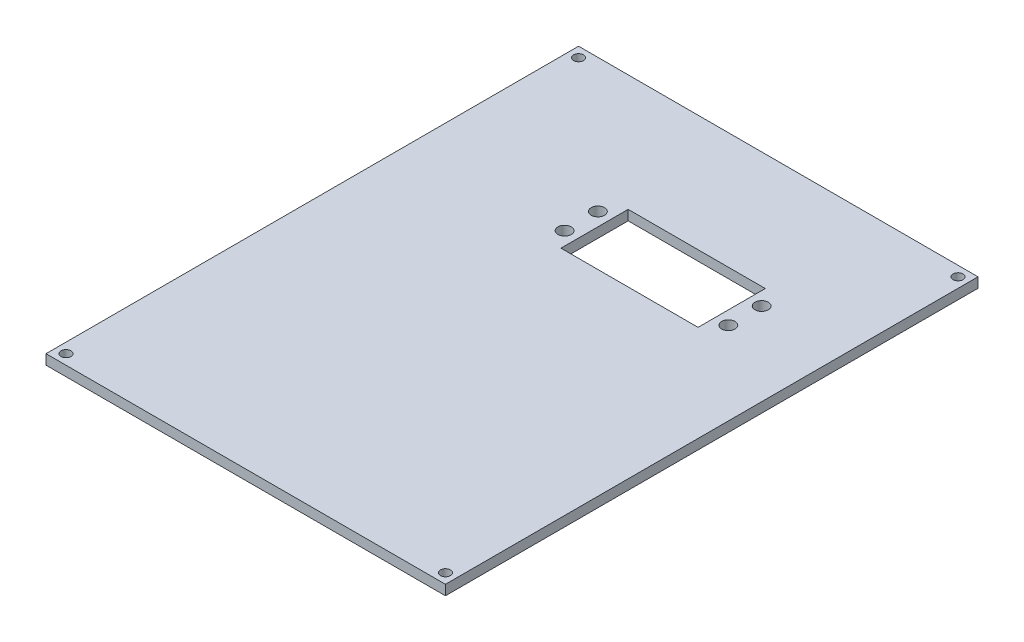
ISO-10303-21;
HEADER;
FILE_DESCRIPTION(('STEP AP214'),'2;1');
FILE_NAME('part.step','',(''),(''),'','','');
FILE_SCHEMA(('AUTOMOTIVE_DESIGN { 1 0 10303 214 1 1 1 1 }'));
ENDSEC;
DATA;
#1=APPLICATION_CONTEXT('core data for automotive mechanical design processes');
#2=APPLICATION_PROTOCOL_DEFINITION('international standard','automotive_design',2000,#1);
#3=PRODUCT_CONTEXT('',#1,'mechanical');
#4=PRODUCT('Part','Part','',(#3));
#5=PRODUCT_RELATED_PRODUCT_CATEGORY('part','',(#4));
#6=PRODUCT_DEFINITION_FORMATION('','',#4);
#7=PRODUCT_DEFINITION_CONTEXT('part definition',#1,'design');
#8=PRODUCT_DEFINITION('design','',#6,#7);
#9=PRODUCT_DEFINITION_SHAPE('','',#8);
#10=(LENGTH_UNIT() NAMED_UNIT(*) SI_UNIT(.MILLI.,.METRE.));
#11=(NAMED_UNIT(*) PLANE_ANGLE_UNIT() SI_UNIT($,.RADIAN.));
#12=(NAMED_UNIT(*) SI_UNIT($,.STERADIAN.) SOLID_ANGLE_UNIT());
#13=UNCERTAINTY_MEASURE_WITH_UNIT(LENGTH_MEASURE(1.E-05),#10,'distance_accuracy_value','');
#14=(GEOMETRIC_REPRESENTATION_CONTEXT(3) GLOBAL_UNCERTAINTY_ASSIGNED_CONTEXT((#13)) GLOBAL_UNIT_ASSIGNED_CONTEXT((#10,
#11,#12)) REPRESENTATION_CONTEXT('',''));
#15=CARTESIAN_POINT('',(0.,0.,0.));
#16=DIRECTION('',(0.,0.,1.));
#17=DIRECTION('',(1.,0.,0.));
#18=AXIS2_PLACEMENT_3D('',#15,#16,#17);
#19=CARTESIAN_POINT('',(0.,3.,0.));
#20=DIRECTION('',(0.,1.,0.));
#21=DIRECTION('',(0.,0.,1.));
#22=AXIS2_PLACEMENT_3D('',#19,#20,#21);
#23=PLANE('',#22);
#24=CARTESIAN_POINT('',(-24.9,3.,-119.9));
#25=DIRECTION('',(0.,1.,0.));
#26=DIRECTION('',(0.,0.,1.));
#27=AXIS2_PLACEMENT_3D('',#24,#25,#26);
#28=CIRCLE('',#27,2.);
#29=CARTESIAN_POINT('',(-24.9,3.,-117.9));
#30=VERTEX_POINT('',#29);
#31=EDGE_CURVE('E129',#30,#30,#28,.T.);
#32=ORIENTED_EDGE('',*,*,#31,.F.);
#33=EDGE_LOOP('',(#32));
#34=FACE_BOUND('',#33,.T.);
#35=CARTESIAN_POINT('',(-74.1,3.,-119.9));
#36=DIRECTION('',(0.,1.,0.));
#37=DIRECTION('',(0.,0.,1.));
#38=AXIS2_PLACEMENT_3D('',#35,#36,#37);
#39=CIRCLE('',#38,2.);
#40=CARTESIAN_POINT('',(-74.1,3.,-117.9));
#41=VERTEX_POINT('',#40);
#42=EDGE_CURVE('E145',#41,#41,#39,.T.);
#43=ORIENTED_EDGE('',*,*,#42,.F.);
#44=EDGE_LOOP('',(#43));
#45=FACE_BOUND('',#44,.T.);
#46=CARTESIAN_POINT('',(-117.,3.,-3.));
#47=DIRECTION('',(0.,1.,0.));
#48=DIRECTION('',(0.,0.,1.));
#49=AXIS2_PLACEMENT_3D('',#46,#47,#48);
#50=CIRCLE('',#49,1.5);
#51=CARTESIAN_POINT('',(-117.,3.,-1.5));
#52=VERTEX_POINT('',#51);
#53=EDGE_CURVE('E157',#52,#52,#50,.T.);
#54=ORIENTED_EDGE('',*,*,#53,.F.);
#55=EDGE_LOOP('',(#54));
#56=FACE_BOUND('',#55,.T.);
#57=CARTESIAN_POINT('',(-117.,3.,-157.));
#58=DIRECTION('',(0.,1.,0.));
#59=DIRECTION('',(0.,0.,1.));
#60=AXIS2_PLACEMENT_3D('',#57,#58,#59);
#61=CIRCLE('',#60,1.5);
#62=CARTESIAN_POINT('',(-117.,3.,-155.5));
#63=VERTEX_POINT('',#62);
#64=EDGE_CURVE('E169',#63,#63,#61,.T.);
#65=ORIENTED_EDGE('',*,*,#64,.F.);
#66=EDGE_LOOP('',(#65));
#67=FACE_BOUND('',#66,.T.);
#68=DIRECTION('',(0.,0.,1.));
#69=VECTOR('',#68,1.);
#70=CARTESIAN_POINT('',(-120.,3.,-160.));
#71=LINE('',#70,#69);
#72=CARTESIAN_POINT('',(-120.,3.,-160.));
#73=VERTEX_POINT('',#72);
#74=CARTESIAN_POINT('',(-120.,3.,0.));
#75=VERTEX_POINT('',#74);
#76=EDGE_CURVE('E175',#73,#75,#71,.T.);
#77=ORIENTED_EDGE('',*,*,#76,.T.);
#78=DIRECTION('',(1.,0.,0.));
#79=VECTOR('',#78,1.);
#80=CARTESIAN_POINT('',(-120.,3.,0.));
#81=LINE('',#80,#79);
#82=CARTESIAN_POINT('',(0.,3.,0.));
#83=VERTEX_POINT('',#82);
#84=EDGE_CURVE('E178',#75,#83,#81,.T.);
#85=ORIENTED_EDGE('',*,*,#84,.T.);
#86=DIRECTION('',(0.,0.,-1.));
#87=VECTOR('',#86,1.);
#88=CARTESIAN_POINT('',(0.,3.,-160.));
#89=LINE('',#88,#87);
#90=CARTESIAN_POINT('',(0.,3.,-160.));
#91=VERTEX_POINT('',#90);
#92=EDGE_CURVE('E181',#83,#91,#89,.T.);
#93=ORIENTED_EDGE('',*,*,#92,.T.);
#94=DIRECTION('',(-1.,0.,0.));
#95=VECTOR('',#94,1.);
#96=CARTESIAN_POINT('',(-120.,3.,-160.));
#97=LINE('',#96,#95);
#98=EDGE_CURVE('E183',#91,#73,#97,.T.);
#99=ORIENTED_EDGE('',*,*,#98,.T.);
#100=EDGE_LOOP('',(#77,#85,#93,#99));
#101=FACE_BOUND('',#100,.T.);
#102=CARTESIAN_POINT('',(-3.,3.,-157.));
#103=DIRECTION('',(0.,1.,0.));
#104=DIRECTION('',(0.,0.,1.));
#105=AXIS2_PLACEMENT_3D('',#102,#103,#104);
#106=CIRCLE('',#105,1.5);
#107=CARTESIAN_POINT('',(-3.,3.,-155.5));
#108=VERTEX_POINT('',#107);
#109=EDGE_CURVE('E163',#108,#108,#106,.T.);
#110=ORIENTED_EDGE('',*,*,#109,.F.);
#111=EDGE_LOOP('',(#110));
#112=FACE_BOUND('',#111,.T.);
#113=CARTESIAN_POINT('',(-2.99999999999998,3.,-3.));
#114=DIRECTION('',(0.,1.,0.));
#115=DIRECTION('',(0.,0.,1.));
#116=AXIS2_PLACEMENT_3D('',#113,#114,#115);
#117=CIRCLE('',#116,1.5);
#118=CARTESIAN_POINT('',(-2.99999999999998,3.,-1.5));
#119=VERTEX_POINT('',#118);
#120=EDGE_CURVE('E151',#119,#119,#117,.T.);
#121=ORIENTED_EDGE('',*,*,#120,.F.);
#122=EDGE_LOOP('',(#121));
#123=FACE_BOUND('',#122,.T.);
#124=CARTESIAN_POINT('',(-74.1,3.,-109.9));
#125=DIRECTION('',(0.,1.,0.));
#126=DIRECTION('',(0.,0.,1.));
#127=AXIS2_PLACEMENT_3D('',#124,#125,#126);
#128=CIRCLE('',#127,2.);
#129=CARTESIAN_POINT('',(-74.1,3.,-107.9));
#130=VERTEX_POINT('',#129);
#131=EDGE_CURVE('E139',#130,#130,#128,.T.);
#132=ORIENTED_EDGE('',*,*,#131,.F.);
#133=EDGE_LOOP('',(#132));
#134=FACE_BOUND('',#133,.T.);
#135=DIRECTION('',(1.,0.,0.));
#136=VECTOR('',#135,1.);
#137=CARTESIAN_POINT('',(-70.1,3.,-104.8));
#138=LINE('',#137,#136);
#139=CARTESIAN_POINT('',(-70.1,3.,-104.8));
#140=VERTEX_POINT('',#139);
#141=CARTESIAN_POINT('',(-28.9,3.,-104.8));
#142=VERTEX_POINT('',#141);
#143=EDGE_CURVE('E108',#140,#142,#138,.T.);
#144=ORIENTED_EDGE('',*,*,#143,.F.);
#145=DIRECTION('',(0.,0.,1.));
#146=VECTOR('',#145,1.);
#147=CARTESIAN_POINT('',(-70.1,3.,-125.));
#148=LINE('',#147,#146);
#149=CARTESIAN_POINT('',(-70.1,3.,-125.));
#150=VERTEX_POINT('',#149);
#151=EDGE_CURVE('E100',#150,#140,#148,.T.);
#152=ORIENTED_EDGE('',*,*,#151,.F.);
#153=DIRECTION('',(-1.,0.,0.));
#154=VECTOR('',#153,1.);
#155=CARTESIAN_POINT('',(-70.1,3.,-125.));
#156=LINE('',#155,#154);
#157=CARTESIAN_POINT('',(-28.9,3.,-125.));
#158=VERTEX_POINT('',#157);
#159=EDGE_CURVE('E123',#158,#150,#156,.T.);
#160=ORIENTED_EDGE('',*,*,#159,.F.);
#161=DIRECTION('',(0.,0.,-1.));
#162=VECTOR('',#161,1.);
#163=CARTESIAN_POINT('',(-28.9,3.,-125.));
#164=LINE('',#163,#162);
#165=EDGE_CURVE('E121',#142,#158,#164,.T.);
#166=ORIENTED_EDGE('',*,*,#165,.F.);
#167=EDGE_LOOP('',(#144,#152,#160,#166));
#168=FACE_BOUND('',#167,.T.);
#169=CARTESIAN_POINT('',(-24.9,3.,-109.9));
#170=DIRECTION('',(0.,1.,0.));
#171=DIRECTION('',(0.,0.,1.));
#172=AXIS2_PLACEMENT_3D('',#169,#170,#171);
#173=CIRCLE('',#172,2.);
#174=CARTESIAN_POINT('',(-24.9,3.,-107.9));
#175=VERTEX_POINT('',#174);
#176=EDGE_CURVE('E298',#175,#175,#173,.T.);
#177=ORIENTED_EDGE('',*,*,#176,.F.);
#178=EDGE_LOOP('',(#177));
#179=FACE_BOUND('',#178,.T.);
#180=ADVANCED_FACE('F35',(#34,#45,#56,#67,#101,#112,#123,#134,#168,#179),#23,.T.);
#181=CARTESIAN_POINT('',(0.,0.,0.));
#182=DIRECTION('',(0.,1.,0.));
#183=DIRECTION('',(0.,0.,1.));
#184=AXIS2_PLACEMENT_3D('',#181,#182,#183);
#185=PLANE('',#184);
#186=CARTESIAN_POINT('',(-74.1,0.,-109.9));
#187=DIRECTION('',(0.,1.,0.));
#188=DIRECTION('',(0.,0.,1.));
#189=AXIS2_PLACEMENT_3D('',#186,#187,#188);
#190=CIRCLE('',#189,2.);
#191=CARTESIAN_POINT('',(-74.1,0.,-107.9));
#192=VERTEX_POINT('',#191);
#193=EDGE_CURVE('E116',#192,#192,#190,.T.);
#194=ORIENTED_EDGE('',*,*,#193,.T.);
#195=EDGE_LOOP('',(#194));
#196=FACE_BOUND('',#195,.T.);
#197=CARTESIAN_POINT('',(-74.1,0.,-119.9));
#198=DIRECTION('',(0.,1.,0.));
#199=DIRECTION('',(0.,0.,1.));
#200=AXIS2_PLACEMENT_3D('',#197,#198,#199);
#201=CIRCLE('',#200,2.);
#202=CARTESIAN_POINT('',(-74.1,0.,-117.9));
#203=VERTEX_POINT('',#202);
#204=EDGE_CURVE('E142',#203,#203,#201,.T.);
#205=ORIENTED_EDGE('',*,*,#204,.T.);
#206=EDGE_LOOP('',(#205));
#207=FACE_BOUND('',#206,.T.);
#208=CARTESIAN_POINT('',(-2.99999999999998,0.,-3.));
#209=DIRECTION('',(0.,1.,0.));
#210=DIRECTION('',(0.,0.,1.));
#211=AXIS2_PLACEMENT_3D('',#208,#209,#210);
#212=CIRCLE('',#211,1.5);
#213=CARTESIAN_POINT('',(-2.99999999999998,0.,-1.5));
#214=VERTEX_POINT('',#213);
#215=EDGE_CURVE('E148',#214,#214,#212,.T.);
#216=ORIENTED_EDGE('',*,*,#215,.T.);
#217=EDGE_LOOP('',(#216));
#218=FACE_BOUND('',#217,.T.);
#219=CARTESIAN_POINT('',(-117.,0.,-3.));
#220=DIRECTION('',(0.,1.,0.));
#221=DIRECTION('',(0.,0.,1.));
#222=AXIS2_PLACEMENT_3D('',#219,#220,#221);
#223=CIRCLE('',#222,1.5);
#224=CARTESIAN_POINT('',(-117.,0.,-1.5));
#225=VERTEX_POINT('',#224);
#226=EDGE_CURVE('E154',#225,#225,#223,.T.);
#227=ORIENTED_EDGE('',*,*,#226,.T.);
#228=EDGE_LOOP('',(#227));
#229=FACE_BOUND('',#228,.T.);
#230=CARTESIAN_POINT('',(-3.,0.,-157.));
#231=DIRECTION('',(0.,1.,0.));
#232=DIRECTION('',(0.,0.,1.));
#233=AXIS2_PLACEMENT_3D('',#230,#231,#232);
#234=CIRCLE('',#233,1.5);
#235=CARTESIAN_POINT('',(-3.,0.,-155.5));
#236=VERTEX_POINT('',#235);
#237=EDGE_CURVE('E160',#236,#236,#234,.T.);
#238=ORIENTED_EDGE('',*,*,#237,.T.);
#239=EDGE_LOOP('',(#238));
#240=FACE_BOUND('',#239,.T.);
#241=CARTESIAN_POINT('',(-117.,0.,-157.));
#242=DIRECTION('',(0.,1.,0.));
#243=DIRECTION('',(0.,0.,1.));
#244=AXIS2_PLACEMENT_3D('',#241,#242,#243);
#245=CIRCLE('',#244,1.5);
#246=CARTESIAN_POINT('',(-117.,0.,-155.5));
#247=VERTEX_POINT('',#246);
#248=EDGE_CURVE('E166',#247,#247,#245,.T.);
#249=ORIENTED_EDGE('',*,*,#248,.T.);
#250=EDGE_LOOP('',(#249));
#251=FACE_BOUND('',#250,.T.);
#252=DIRECTION('',(0.,0.,1.));
#253=VECTOR('',#252,1.);
#254=CARTESIAN_POINT('',(-120.,0.,-160.));
#255=LINE('',#254,#253);
#256=CARTESIAN_POINT('',(-120.,0.,-160.));
#257=VERTEX_POINT('',#256);
#258=CARTESIAN_POINT('',(-120.,0.,0.));
#259=VERTEX_POINT('',#258);
#260=EDGE_CURVE('E172',#257,#259,#255,.T.);
#261=ORIENTED_EDGE('',*,*,#260,.F.);
#262=DIRECTION('',(-1.,0.,0.));
#263=VECTOR('',#262,1.);
#264=CARTESIAN_POINT('',(-120.,0.,-160.));
#265=LINE('',#264,#263);
#266=CARTESIAN_POINT('',(0.,0.,-160.));
#267=VERTEX_POINT('',#266);
#268=EDGE_CURVE('E179',#267,#257,#265,.T.);
#269=ORIENTED_EDGE('',*,*,#268,.F.);
#270=DIRECTION('',(0.,0.,-1.));
#271=VECTOR('',#270,1.);
#272=CARTESIAN_POINT('',(0.,0.,-160.));
#273=LINE('',#272,#271);
#274=CARTESIAN_POINT('',(0.,0.,0.));
#275=VERTEX_POINT('',#274);
#276=EDGE_CURVE('E190',#275,#267,#273,.T.);
#277=ORIENTED_EDGE('',*,*,#276,.F.);
#278=DIRECTION('',(1.,0.,0.));
#279=VECTOR('',#278,1.);
#280=CARTESIAN_POINT('',(-120.,0.,0.));
#281=LINE('',#280,#279);
#282=EDGE_CURVE('E188',#259,#275,#281,.T.);
#283=ORIENTED_EDGE('',*,*,#282,.F.);
#284=EDGE_LOOP('',(#261,#269,#277,#283));
#285=FACE_BOUND('',#284,.T.);
#286=DIRECTION('',(0.,0.,1.));
#287=VECTOR('',#286,1.);
#288=CARTESIAN_POINT('',(-70.1,0.,-125.));
#289=LINE('',#288,#287);
#290=CARTESIAN_POINT('',(-70.1,0.,-125.));
#291=VERTEX_POINT('',#290);
#292=CARTESIAN_POINT('',(-70.1,0.,-104.8));
#293=VERTEX_POINT('',#292);
#294=EDGE_CURVE('E58',#291,#293,#289,.T.);
#295=ORIENTED_EDGE('',*,*,#294,.T.);
#296=DIRECTION('',(1.,0.,0.));
#297=VECTOR('',#296,1.);
#298=CARTESIAN_POINT('',(-70.1,0.,-104.8));
#299=LINE('',#298,#297);
#300=CARTESIAN_POINT('',(-28.9,0.,-104.8));
#301=VERTEX_POINT('',#300);
#302=EDGE_CURVE('E115',#293,#301,#299,.T.);
#303=ORIENTED_EDGE('',*,*,#302,.T.);
#304=DIRECTION('',(0.,0.,-1.));
#305=VECTOR('',#304,1.);
#306=CARTESIAN_POINT('',(-28.9,0.,-125.));
#307=LINE('',#306,#305);
#308=CARTESIAN_POINT('',(-28.9,0.,-125.));
#309=VERTEX_POINT('',#308);
#310=EDGE_CURVE('E131',#301,#309,#307,.T.);
#311=ORIENTED_EDGE('',*,*,#310,.T.);
#312=DIRECTION('',(-1.,0.,0.));
#313=VECTOR('',#312,1.);
#314=CARTESIAN_POINT('',(-70.1,0.,-125.));
#315=LINE('',#314,#313);
#316=EDGE_CURVE('E109',#309,#291,#315,.T.);
#317=ORIENTED_EDGE('',*,*,#316,.T.);
#318=EDGE_LOOP('',(#295,#303,#311,#317));
#319=FACE_BOUND('',#318,.T.);
#320=CARTESIAN_POINT('',(-24.9,0.,-119.9));
#321=DIRECTION('',(0.,1.,0.));
#322=DIRECTION('',(0.,0.,1.));
#323=AXIS2_PLACEMENT_3D('',#320,#321,#322);
#324=CIRCLE('',#323,2.);
#325=CARTESIAN_POINT('',(-24.9,0.,-117.9));
#326=VERTEX_POINT('',#325);
#327=EDGE_CURVE('E304',#326,#326,#324,.T.);
#328=ORIENTED_EDGE('',*,*,#327,.T.);
#329=EDGE_LOOP('',(#328));
#330=FACE_BOUND('',#329,.T.);
#331=CARTESIAN_POINT('',(-24.9,0.,-109.9));
#332=DIRECTION('',(0.,1.,0.));
#333=DIRECTION('',(0.,0.,1.));
#334=AXIS2_PLACEMENT_3D('',#331,#332,#333);
#335=CIRCLE('',#334,2.);
#336=CARTESIAN_POINT('',(-24.9,0.,-107.9));
#337=VERTEX_POINT('',#336);
#338=EDGE_CURVE('E301',#337,#337,#335,.T.);
#339=ORIENTED_EDGE('',*,*,#338,.T.);
#340=EDGE_LOOP('',(#339));
#341=FACE_BOUND('',#340,.T.);
#342=ADVANCED_FACE('F208',(#196,#207,#218,#229,#240,#251,#285,#319,#330,#341),#185,.F.);
#343=CARTESIAN_POINT('',(-120.,3.,-160.));
#344=DIRECTION('',(1.,0.,0.));
#345=DIRECTION('',(0.,0.,-1.));
#346=AXIS2_PLACEMENT_3D('',#343,#344,#345);
#347=PLANE('',#346);
#348=ORIENTED_EDGE('',*,*,#260,.T.);
#349=DIRECTION('',(0.,-1.,0.));
#350=VECTOR('',#349,1.);
#351=CARTESIAN_POINT('',(-120.,3.,0.));
#352=LINE('',#351,#350);
#353=EDGE_CURVE('E11',#75,#259,#352,.T.);
#354=ORIENTED_EDGE('',*,*,#353,.F.);
#355=ORIENTED_EDGE('',*,*,#76,.F.);
#356=DIRECTION('',(0.,-1.,0.));
#357=VECTOR('',#356,1.);
#358=CARTESIAN_POINT('',(-120.,3.,-160.));
#359=LINE('',#358,#357);
#360=EDGE_CURVE('E185',#73,#257,#359,.T.);
#361=ORIENTED_EDGE('',*,*,#360,.T.);
#362=EDGE_LOOP('',(#348,#354,#355,#361));
#363=FACE_BOUND('',#362,.T.);
#364=ADVANCED_FACE('F37',(#363),#347,.F.);
#365=CARTESIAN_POINT('',(-120.,3.,0.));
#366=DIRECTION('',(0.,0.,-1.));
#367=DIRECTION('',(-1.,0.,0.));
#368=AXIS2_PLACEMENT_3D('',#365,#366,#367);
#369=PLANE('',#368);
#370=ORIENTED_EDGE('',*,*,#282,.T.);
#371=DIRECTION('',(0.,-1.,0.));
#372=VECTOR('',#371,1.);
#373=CARTESIAN_POINT('',(0.,3.,0.));
#374=LINE('',#373,#372);
#375=EDGE_CURVE('E43',#83,#275,#374,.T.);
#376=ORIENTED_EDGE('',*,*,#375,.F.);
#377=ORIENTED_EDGE('',*,*,#84,.F.);
#378=ORIENTED_EDGE('',*,*,#353,.T.);
#379=EDGE_LOOP('',(#370,#376,#377,#378));
#380=FACE_BOUND('',#379,.T.);
#381=ADVANCED_FACE('F219',(#380),#369,.F.);
#382=CARTESIAN_POINT('',(0.,3.,-160.));
#383=DIRECTION('',(-1.,0.,0.));
#384=DIRECTION('',(0.,0.,1.));
#385=AXIS2_PLACEMENT_3D('',#382,#383,#384);
#386=PLANE('',#385);
#387=ORIENTED_EDGE('',*,*,#276,.T.);
#388=DIRECTION('',(0.,-1.,0.));
#389=VECTOR('',#388,1.);
#390=CARTESIAN_POINT('',(0.,3.,-160.));
#391=LINE('',#390,#389);
#392=EDGE_CURVE('E195',#91,#267,#391,.T.);
#393=ORIENTED_EDGE('',*,*,#392,.F.);
#394=ORIENTED_EDGE('',*,*,#92,.F.);
#395=ORIENTED_EDGE('',*,*,#375,.T.);
#396=EDGE_LOOP('',(#387,#393,#394,#395));
#397=FACE_BOUND('',#396,.T.);
#398=ADVANCED_FACE('F202',(#397),#386,.F.);
#399=CARTESIAN_POINT('',(-120.,3.,-160.));
#400=DIRECTION('',(0.,0.,1.));
#401=DIRECTION('',(1.,0.,0.));
#402=AXIS2_PLACEMENT_3D('',#399,#400,#401);
#403=PLANE('',#402);
#404=ORIENTED_EDGE('',*,*,#268,.T.);
#405=ORIENTED_EDGE('',*,*,#360,.F.);
#406=ORIENTED_EDGE('',*,*,#98,.F.);
#407=ORIENTED_EDGE('',*,*,#392,.T.);
#408=EDGE_LOOP('',(#404,#405,#406,#407));
#409=FACE_BOUND('',#408,.T.);
#410=ADVANCED_FACE('F212',(#409),#403,.F.);
#411=CARTESIAN_POINT('',(-117.,3.,-157.));
#412=DIRECTION('',(0.,-1.,0.));
#413=DIRECTION('',(0.,0.,-1.));
#414=AXIS2_PLACEMENT_3D('',#411,#412,#413);
#415=CYLINDRICAL_SURFACE('',#414,1.5);
#416=ORIENTED_EDGE('',*,*,#64,.T.);
#417=EDGE_LOOP('',(#416));
#418=FACE_BOUND('',#417,.T.);
#419=ORIENTED_EDGE('',*,*,#248,.F.);
#420=EDGE_LOOP('',(#419));
#421=FACE_BOUND('',#420,.T.);
#422=ADVANCED_FACE('F237',(#418,#421),#415,.F.);
#423=CARTESIAN_POINT('',(-3.,3.,-157.));
#424=DIRECTION('',(0.,-1.,0.));
#425=DIRECTION('',(0.,0.,-1.));
#426=AXIS2_PLACEMENT_3D('',#423,#424,#425);
#427=CYLINDRICAL_SURFACE('',#426,1.5);
#428=ORIENTED_EDGE('',*,*,#109,.T.);
#429=EDGE_LOOP('',(#428));
#430=FACE_BOUND('',#429,.T.);
#431=ORIENTED_EDGE('',*,*,#237,.F.);
#432=EDGE_LOOP('',(#431));
#433=FACE_BOUND('',#432,.T.);
#434=ADVANCED_FACE('F244',(#430,#433),#427,.F.);
#435=CARTESIAN_POINT('',(-117.,3.,-3.));
#436=DIRECTION('',(0.,-1.,0.));
#437=DIRECTION('',(0.,0.,-1.));
#438=AXIS2_PLACEMENT_3D('',#435,#436,#437);
#439=CYLINDRICAL_SURFACE('',#438,1.5);
#440=ORIENTED_EDGE('',*,*,#53,.T.);
#441=EDGE_LOOP('',(#440));
#442=FACE_BOUND('',#441,.T.);
#443=ORIENTED_EDGE('',*,*,#226,.F.);
#444=EDGE_LOOP('',(#443));
#445=FACE_BOUND('',#444,.T.);
#446=ADVANCED_FACE('F249',(#442,#445),#439,.F.);
#447=CARTESIAN_POINT('',(-2.99999999999998,3.,-3.));
#448=DIRECTION('',(0.,-1.,0.));
#449=DIRECTION('',(0.,0.,-1.));
#450=AXIS2_PLACEMENT_3D('',#447,#448,#449);
#451=CYLINDRICAL_SURFACE('',#450,1.5);
#452=ORIENTED_EDGE('',*,*,#120,.T.);
#453=EDGE_LOOP('',(#452));
#454=FACE_BOUND('',#453,.T.);
#455=ORIENTED_EDGE('',*,*,#215,.F.);
#456=EDGE_LOOP('',(#455));
#457=FACE_BOUND('',#456,.T.);
#458=ADVANCED_FACE('F259',(#454,#457),#451,.F.);
#459=CARTESIAN_POINT('',(-74.1,3.,-119.9));
#460=DIRECTION('',(0.,-1.,0.));
#461=DIRECTION('',(0.,0.,-1.));
#462=AXIS2_PLACEMENT_3D('',#459,#460,#461);
#463=CYLINDRICAL_SURFACE('',#462,2.);
#464=ORIENTED_EDGE('',*,*,#42,.T.);
#465=EDGE_LOOP('',(#464));
#466=FACE_BOUND('',#465,.T.);
#467=ORIENTED_EDGE('',*,*,#204,.F.);
#468=EDGE_LOOP('',(#467));
#469=FACE_BOUND('',#468,.T.);
#470=ADVANCED_FACE('F266',(#466,#469),#463,.F.);
#471=CARTESIAN_POINT('',(-74.1,3.,-109.9));
#472=DIRECTION('',(0.,-1.,0.));
#473=DIRECTION('',(0.,0.,-1.));
#474=AXIS2_PLACEMENT_3D('',#471,#472,#473);
#475=CYLINDRICAL_SURFACE('',#474,2.);
#476=ORIENTED_EDGE('',*,*,#131,.T.);
#477=EDGE_LOOP('',(#476));
#478=FACE_BOUND('',#477,.T.);
#479=ORIENTED_EDGE('',*,*,#193,.F.);
#480=EDGE_LOOP('',(#479));
#481=FACE_BOUND('',#480,.T.);
#482=ADVANCED_FACE('F270',(#478,#481),#475,.F.);
#483=CARTESIAN_POINT('',(-70.1,3.,-125.));
#484=DIRECTION('',(1.,0.,0.));
#485=DIRECTION('',(0.,0.,-1.));
#486=AXIS2_PLACEMENT_3D('',#483,#484,#485);
#487=PLANE('',#486);
#488=ORIENTED_EDGE('',*,*,#294,.F.);
#489=DIRECTION('',(0.,-1.,0.));
#490=VECTOR('',#489,1.);
#491=CARTESIAN_POINT('',(-70.1,3.,-125.));
#492=LINE('',#491,#490);
#493=EDGE_CURVE('E104',#150,#291,#492,.T.);
#494=ORIENTED_EDGE('',*,*,#493,.F.);
#495=ORIENTED_EDGE('',*,*,#151,.T.);
#496=DIRECTION('',(0.,-1.,0.));
#497=VECTOR('',#496,1.);
#498=CARTESIAN_POINT('',(-70.1,3.,-104.8));
#499=LINE('',#498,#497);
#500=EDGE_CURVE('E103',#140,#293,#499,.T.);
#501=ORIENTED_EDGE('',*,*,#500,.T.);
#502=EDGE_LOOP('',(#488,#494,#495,#501));
#503=FACE_BOUND('',#502,.T.);
#504=ADVANCED_FACE('F102',(#503),#487,.T.);
#505=CARTESIAN_POINT('',(-70.1,3.,-104.8));
#506=DIRECTION('',(0.,0.,-1.));
#507=DIRECTION('',(-1.,0.,0.));
#508=AXIS2_PLACEMENT_3D('',#505,#506,#507);
#509=PLANE('',#508);
#510=ORIENTED_EDGE('',*,*,#302,.F.);
#511=ORIENTED_EDGE('',*,*,#500,.F.);
#512=ORIENTED_EDGE('',*,*,#143,.T.);
#513=DIRECTION('',(0.,-1.,0.));
#514=VECTOR('',#513,1.);
#515=CARTESIAN_POINT('',(-28.9,3.,-104.8));
#516=LINE('',#515,#514);
#517=EDGE_CURVE('E117',#142,#301,#516,.T.);
#518=ORIENTED_EDGE('',*,*,#517,.T.);
#519=EDGE_LOOP('',(#510,#511,#512,#518));
#520=FACE_BOUND('',#519,.T.);
#521=ADVANCED_FACE('F112',(#520),#509,.T.);
#522=CARTESIAN_POINT('',(-28.9,3.,-125.));
#523=DIRECTION('',(-1.,0.,0.));
#524=DIRECTION('',(0.,0.,1.));
#525=AXIS2_PLACEMENT_3D('',#522,#523,#524);
#526=PLANE('',#525);
#527=ORIENTED_EDGE('',*,*,#310,.F.);
#528=ORIENTED_EDGE('',*,*,#517,.F.);
#529=ORIENTED_EDGE('',*,*,#165,.T.);
#530=DIRECTION('',(0.,-1.,0.));
#531=VECTOR('',#530,1.);
#532=CARTESIAN_POINT('',(-28.9,3.,-125.));
#533=LINE('',#532,#531);
#534=EDGE_CURVE('E50',#158,#309,#533,.T.);
#535=ORIENTED_EDGE('',*,*,#534,.T.);
#536=EDGE_LOOP('',(#527,#528,#529,#535));
#537=FACE_BOUND('',#536,.T.);
#538=ADVANCED_FACE('F279',(#537),#526,.T.);
#539=CARTESIAN_POINT('',(-70.1,3.,-125.));
#540=DIRECTION('',(0.,0.,1.));
#541=DIRECTION('',(1.,0.,0.));
#542=AXIS2_PLACEMENT_3D('',#539,#540,#541);
#543=PLANE('',#542);
#544=ORIENTED_EDGE('',*,*,#316,.F.);
#545=ORIENTED_EDGE('',*,*,#534,.F.);
#546=ORIENTED_EDGE('',*,*,#159,.T.);
#547=ORIENTED_EDGE('',*,*,#493,.T.);
#548=EDGE_LOOP('',(#544,#545,#546,#547));
#549=FACE_BOUND('',#548,.T.);
#550=ADVANCED_FACE('F282',(#549),#543,.T.);
#551=CARTESIAN_POINT('',(-24.9,3.,-119.9));
#552=DIRECTION('',(0.,-1.,0.));
#553=DIRECTION('',(0.,0.,-1.));
#554=AXIS2_PLACEMENT_3D('',#551,#552,#553);
#555=CYLINDRICAL_SURFACE('',#554,2.);
#556=ORIENTED_EDGE('',*,*,#31,.T.);
#557=EDGE_LOOP('',(#556));
#558=FACE_BOUND('',#557,.T.);
#559=ORIENTED_EDGE('',*,*,#327,.F.);
#560=EDGE_LOOP('',(#559));
#561=FACE_BOUND('',#560,.T.);
#562=ADVANCED_FACE('F286',(#558,#561),#555,.F.);
#563=CARTESIAN_POINT('',(-24.9,3.,-109.9));
#564=DIRECTION('',(0.,-1.,0.));
#565=DIRECTION('',(0.,0.,-1.));
#566=AXIS2_PLACEMENT_3D('',#563,#564,#565);
#567=CYLINDRICAL_SURFACE('',#566,2.);
#568=ORIENTED_EDGE('',*,*,#176,.T.);
#569=EDGE_LOOP('',(#568));
#570=FACE_BOUND('',#569,.T.);
#571=ORIENTED_EDGE('',*,*,#338,.F.);
#572=EDGE_LOOP('',(#571));
#573=FACE_BOUND('',#572,.T.);
#574=ADVANCED_FACE('F289',(#570,#573),#567,.F.);
#575=CLOSED_SHELL('',(#180,#342,#364,#381,#398,#410,#422,#434,#446,#458,#470,#482,#504,#521,
#538,#550,#562,#574));
#576=MANIFOLD_SOLID_BREP('B2',#575);
#577=ADVANCED_BREP_SHAPE_REPRESENTATION('',(#18,#576),#14);
#578=SHAPE_DEFINITION_REPRESENTATION(#9,#577);
ENDSEC;
END-ISO-10303-21;
